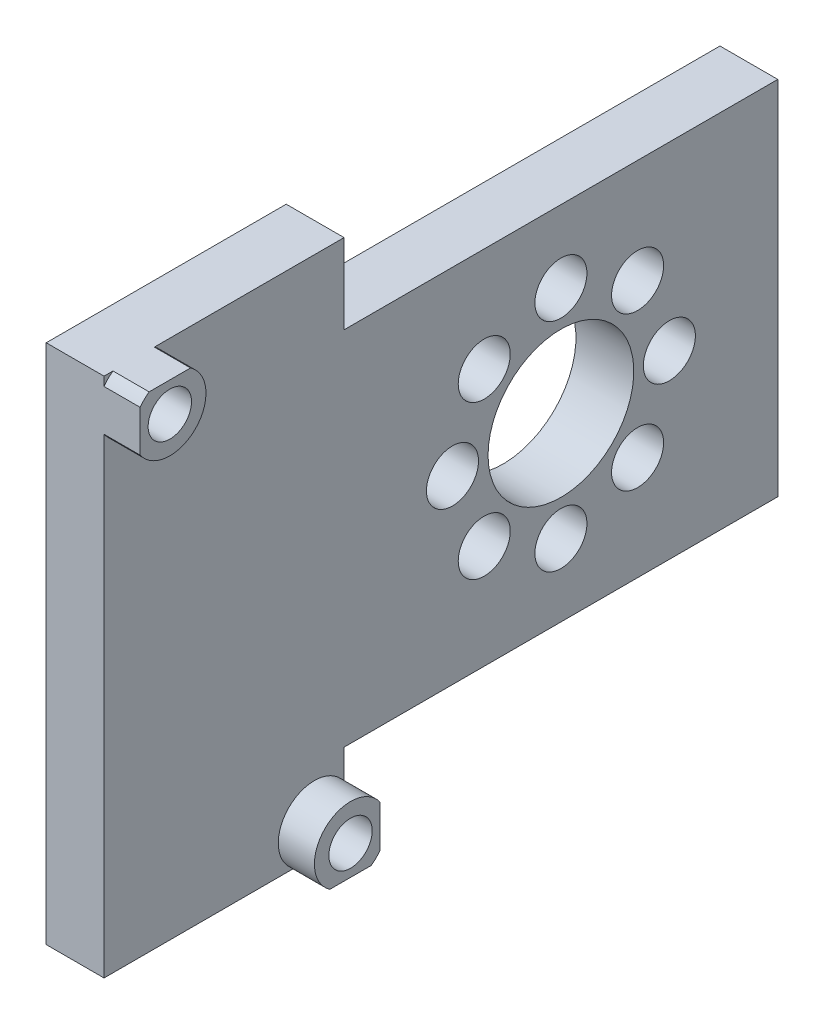
ISO-10303-21;
HEADER;
FILE_DESCRIPTION(('STEP AP214'),'2;1');
FILE_NAME('part.step','',(''),(''),'','','');
FILE_SCHEMA(('AUTOMOTIVE_DESIGN { 1 0 10303 214 1 1 1 1 }'));
ENDSEC;
DATA;
#1=APPLICATION_CONTEXT('core data for automotive mechanical design processes');
#2=APPLICATION_PROTOCOL_DEFINITION('international standard','automotive_design',2000,#1);
#3=PRODUCT_CONTEXT('',#1,'mechanical');
#4=PRODUCT('Part','Part','',(#3));
#5=PRODUCT_RELATED_PRODUCT_CATEGORY('part','',(#4));
#6=PRODUCT_DEFINITION_FORMATION('','',#4);
#7=PRODUCT_DEFINITION_CONTEXT('part definition',#1,'design');
#8=PRODUCT_DEFINITION('design','',#6,#7);
#9=PRODUCT_DEFINITION_SHAPE('','',#8);
#10=(LENGTH_UNIT() NAMED_UNIT(*) SI_UNIT(.MILLI.,.METRE.));
#11=(NAMED_UNIT(*) PLANE_ANGLE_UNIT() SI_UNIT($,.RADIAN.));
#12=(NAMED_UNIT(*) SI_UNIT($,.STERADIAN.) SOLID_ANGLE_UNIT());
#13=UNCERTAINTY_MEASURE_WITH_UNIT(LENGTH_MEASURE(1.E-05),#10,'distance_accuracy_value','');
#14=(GEOMETRIC_REPRESENTATION_CONTEXT(3) GLOBAL_UNCERTAINTY_ASSIGNED_CONTEXT((#13)) GLOBAL_UNIT_ASSIGNED_CONTEXT((#10,
#11,#12)) REPRESENTATION_CONTEXT('',''));
#15=CARTESIAN_POINT('',(0.,0.,0.));
#16=DIRECTION('',(0.,0.,1.));
#17=DIRECTION('',(1.,0.,0.));
#18=AXIS2_PLACEMENT_3D('',#15,#16,#17);
#19=CARTESIAN_POINT('',(5.08,-22.89175,-10.541));
#20=DIRECTION('',(0.,0.,1.));
#21=DIRECTION('',(1.,0.,0.));
#22=AXIS2_PLACEMENT_3D('',#19,#20,#21);
#23=PLANE('',#22);
#24=DIRECTION('',(0.,1.,0.));
#25=VECTOR('',#24,1.);
#26=CARTESIAN_POINT('',(0.,-22.89175,-10.541));
#27=LINE('',#26,#25);
#28=CARTESIAN_POINT('',(0.,-22.89175,-10.541));
#29=VERTEX_POINT('',#28);
#30=CARTESIAN_POINT('',(0.,-15.875,-10.541));
#31=VERTEX_POINT('',#30);
#32=EDGE_CURVE('E277',#29,#31,#27,.T.);
#33=ORIENTED_EDGE('',*,*,#32,.T.);
#34=DIRECTION('',(-1.,0.,0.));
#35=VECTOR('',#34,1.);
#36=CARTESIAN_POINT('',(5.08,-15.875,-10.541));
#37=LINE('',#36,#35);
#38=CARTESIAN_POINT('',(5.08,-15.875,-10.541));
#39=VERTEX_POINT('',#38);
#40=EDGE_CURVE('E62',#39,#31,#37,.T.);
#41=ORIENTED_EDGE('',*,*,#40,.F.);
#42=DIRECTION('',(0.,1.,0.));
#43=VECTOR('',#42,1.);
#44=CARTESIAN_POINT('',(5.08,-22.89175,-10.541));
#45=LINE('',#44,#43);
#46=CARTESIAN_POINT('',(5.08,-18.4709958213007,-10.541));
#47=VERTEX_POINT('',#46);
#48=EDGE_CURVE('E269',#47,#39,#45,.T.);
#49=ORIENTED_EDGE('',*,*,#48,.F.);
#50=DIRECTION('',(-1.,0.,0.));
#51=VECTOR('',#50,1.);
#52=CARTESIAN_POINT('',(8.255,-18.4709958213007,-10.541));
#53=LINE('',#52,#51);
#54=CARTESIAN_POINT('',(8.255,-18.4709958213007,-10.541));
#55=VERTEX_POINT('',#54);
#56=EDGE_CURVE('E216',#55,#47,#53,.T.);
#57=ORIENTED_EDGE('',*,*,#56,.F.);
#58=DIRECTION('',(0.,1.,0.));
#59=VECTOR('',#58,1.);
#60=CARTESIAN_POINT('',(8.255,-22.1055041786993,-10.541));
#61=LINE('',#60,#59);
#62=CARTESIAN_POINT('',(8.255,-22.1055041786993,-10.541));
#63=VERTEX_POINT('',#62);
#64=EDGE_CURVE('E199',#63,#55,#61,.T.);
#65=ORIENTED_EDGE('',*,*,#64,.F.);
#66=DIRECTION('',(-1.,0.,0.));
#67=VECTOR('',#66,1.);
#68=CARTESIAN_POINT('',(8.255,-22.1055041786993,-10.541));
#69=LINE('',#68,#67);
#70=CARTESIAN_POINT('',(5.08,-22.1055041786993,-10.541));
#71=VERTEX_POINT('',#70);
#72=EDGE_CURVE('E219',#63,#71,#69,.T.);
#73=ORIENTED_EDGE('',*,*,#72,.T.);
#74=CARTESIAN_POINT('',(5.08,-22.89175,-10.541));
#75=VERTEX_POINT('',#74);
#76=EDGE_CURVE('E266',#75,#71,#45,.T.);
#77=ORIENTED_EDGE('',*,*,#76,.F.);
#78=DIRECTION('',(-1.,0.,0.));
#79=VECTOR('',#78,1.);
#80=CARTESIAN_POINT('',(5.08,-22.89175,-10.541));
#81=LINE('',#80,#79);
#82=EDGE_CURVE('E281',#75,#29,#81,.T.);
#83=ORIENTED_EDGE('',*,*,#82,.T.);
#84=EDGE_LOOP('',(#33,#41,#49,#57,#65,#73,#77,#83));
#85=FACE_BOUND('',#84,.T.);
#86=ADVANCED_FACE('F39',(#85),#23,.F.);
#87=CARTESIAN_POINT('',(5.08,0.,0.));
#88=DIRECTION('',(1.,0.,0.));
#89=DIRECTION('',(0.,0.,-1.));
#90=AXIS2_PLACEMENT_3D('',#87,#88,#89);
#91=PLANE('',#90);
#92=CARTESIAN_POINT('',(5.08,-20.28825,-7.9375));
#93=DIRECTION('',(1.,0.,0.));
#94=DIRECTION('',(0.,0.,-1.));
#95=AXIS2_PLACEMENT_3D('',#92,#93,#94);
#96=CIRCLE('',#95,3.175);
#97=CARTESIAN_POINT('',(5.08,-22.89175,-9.7547541786993));
#98=VERTEX_POINT('',#97);
#99=EDGE_CURVE('E194',#98,#71,#96,.T.);
#100=ORIENTED_EDGE('',*,*,#99,.F.);
#101=DIRECTION('',(0.,0.,-1.));
#102=VECTOR('',#101,1.);
#103=CARTESIAN_POINT('',(5.08,-22.89175,10.541));
#104=LINE('',#103,#102);
#105=EDGE_CURVE('E263',#98,#75,#104,.T.);
#106=ORIENTED_EDGE('',*,*,#105,.T.);
#107=ORIENTED_EDGE('',*,*,#76,.T.);
#108=EDGE_LOOP('',(#100,#106,#107));
#109=FACE_BOUND('',#108,.T.);
#110=ADVANCED_FACE('F399',(#109),#91,.T.);
#111=CARTESIAN_POINT('',(5.08,20.28825,7.9375));
#112=DIRECTION('',(1.,0.,0.));
#113=DIRECTION('',(0.,0.,-1.));
#114=AXIS2_PLACEMENT_3D('',#111,#112,#113);
#115=CIRCLE('',#114,3.175);
#116=CARTESIAN_POINT('',(5.08,22.89175,9.75475417869928));
#117=VERTEX_POINT('',#116);
#118=CARTESIAN_POINT('',(5.08,22.1055041786993,10.541));
#119=VERTEX_POINT('',#118);
#120=EDGE_CURVE('E238',#117,#119,#115,.T.);
#121=ORIENTED_EDGE('',*,*,#120,.F.);
#122=DIRECTION('',(0.,0.,1.));
#123=VECTOR('',#122,1.);
#124=CARTESIAN_POINT('',(5.08,22.89175,10.541));
#125=LINE('',#124,#123);
#126=CARTESIAN_POINT('',(5.08,22.89175,10.541));
#127=VERTEX_POINT('',#126);
#128=EDGE_CURVE('E260',#117,#127,#125,.T.);
#129=ORIENTED_EDGE('',*,*,#128,.T.);
#130=DIRECTION('',(0.,-1.,0.));
#131=VECTOR('',#130,1.);
#132=CARTESIAN_POINT('',(5.08,-22.89175,10.541));
#133=LINE('',#132,#131);
#134=EDGE_CURVE('E261',#127,#119,#133,.T.);
#135=ORIENTED_EDGE('',*,*,#134,.T.);
#136=EDGE_LOOP('',(#121,#129,#135));
#137=FACE_BOUND('',#136,.T.);
#138=ADVANCED_FACE('F407',(#137),#91,.T.);
#139=CARTESIAN_POINT('',(5.08,-20.28825,-7.9375));
#140=DIRECTION('',(1.,0.,0.));
#141=DIRECTION('',(0.,0.,-1.));
#142=AXIS2_PLACEMENT_3D('',#139,#140,#141);
#143=CIRCLE('',#142,3.175);
#144=CARTESIAN_POINT('',(5.08,-22.89175,-6.1202458213007));
#145=VERTEX_POINT('',#144);
#146=EDGE_CURVE('E200',#47,#145,#143,.T.);
#147=ORIENTED_EDGE('',*,*,#146,.F.);
#148=ORIENTED_EDGE('',*,*,#48,.T.);
#149=DIRECTION('',(0.,0.,1.));
#150=VECTOR('',#149,1.);
#151=CARTESIAN_POINT('',(5.08,-15.875,-10.541));
#152=LINE('',#151,#150);
#153=CARTESIAN_POINT('',(5.08,-15.875,-48.641));
#154=VERTEX_POINT('',#153);
#155=EDGE_CURVE('E171',#154,#39,#152,.T.);
#156=ORIENTED_EDGE('',*,*,#155,.F.);
#157=DIRECTION('',(0.,-1.,0.));
#158=VECTOR('',#157,1.);
#159=CARTESIAN_POINT('',(5.08,-15.875,-48.641));
#160=LINE('',#159,#158);
#161=CARTESIAN_POINT('',(5.08,15.875,-48.641));
#162=VERTEX_POINT('',#161);
#163=EDGE_CURVE('E158',#162,#154,#160,.T.);
#164=ORIENTED_EDGE('',*,*,#163,.F.);
#165=DIRECTION('',(0.,0.,-1.));
#166=VECTOR('',#165,1.);
#167=CARTESIAN_POINT('',(5.08,15.875,-10.541));
#168=LINE('',#167,#166);
#169=CARTESIAN_POINT('',(5.08,15.875,-10.541));
#170=VERTEX_POINT('',#169);
#171=EDGE_CURVE('E168',#170,#162,#168,.T.);
#172=ORIENTED_EDGE('',*,*,#171,.F.);
#173=CARTESIAN_POINT('',(5.08,22.89175,-10.541));
#174=VERTEX_POINT('',#173);
#175=EDGE_CURVE('E54',#170,#174,#45,.T.);
#176=ORIENTED_EDGE('',*,*,#175,.T.);
#177=CARTESIAN_POINT('',(5.08,22.89175,6.12024582130073));
#178=VERTEX_POINT('',#177);
#179=EDGE_CURVE('E257',#174,#178,#125,.T.);
#180=ORIENTED_EDGE('',*,*,#179,.T.);
#181=CARTESIAN_POINT('',(5.08,20.28825,7.9375));
#182=DIRECTION('',(1.,0.,0.));
#183=DIRECTION('',(0.,0.,-1.));
#184=AXIS2_PLACEMENT_3D('',#181,#182,#183);
#185=CIRCLE('',#184,3.175);
#186=CARTESIAN_POINT('',(5.08,18.4709958213007,10.541));
#187=VERTEX_POINT('',#186);
#188=EDGE_CURVE('E235',#187,#178,#185,.T.);
#189=ORIENTED_EDGE('',*,*,#188,.F.);
#190=CARTESIAN_POINT('',(5.08,-22.89175,10.541));
#191=VERTEX_POINT('',#190);
#192=EDGE_CURVE('E259',#187,#191,#133,.T.);
#193=ORIENTED_EDGE('',*,*,#192,.T.);
#194=EDGE_CURVE('E264',#191,#145,#104,.T.);
#195=ORIENTED_EDGE('',*,*,#194,.T.);
#196=EDGE_LOOP('',(#147,#148,#156,#164,#172,#176,#180,#189,#193,#195));
#197=FACE_BOUND('',#196,.T.);
#198=CARTESIAN_POINT('',(5.08,6.73519209080187,-22.8558079091981));
#199=DIRECTION('',(-1.,0.,0.));
#200=DIRECTION('',(0.,0.,1.));
#201=AXIS2_PLACEMENT_3D('',#198,#199,#200);
#202=CIRCLE('',#201,2.286);
#203=CARTESIAN_POINT('',(5.08,6.73519209080187,-20.5698079091981));
#204=VERTEX_POINT('',#203);
#205=EDGE_CURVE('E347',#204,#204,#202,.T.);
#206=ORIENTED_EDGE('',*,*,#205,.T.);
#207=EDGE_LOOP('',(#206));
#208=FACE_BOUND('',#207,.T.);
#209=CARTESIAN_POINT('',(5.08,9.52500000000001,-29.591));
#210=DIRECTION('',(-1.,0.,0.));
#211=DIRECTION('',(0.,0.,1.));
#212=AXIS2_PLACEMENT_3D('',#209,#210,#211);
#213=CIRCLE('',#212,2.286);
#214=CARTESIAN_POINT('',(5.08,9.52500000000001,-27.305));
#215=VERTEX_POINT('',#214);
#216=EDGE_CURVE('E341',#215,#215,#213,.T.);
#217=ORIENTED_EDGE('',*,*,#216,.T.);
#218=EDGE_LOOP('',(#217));
#219=FACE_BOUND('',#218,.T.);
#220=CARTESIAN_POINT('',(5.08,6.73519209080187,-36.3261920908019));
#221=DIRECTION('',(-1.,0.,0.));
#222=DIRECTION('',(0.,0.,1.));
#223=AXIS2_PLACEMENT_3D('',#220,#221,#222);
#224=CIRCLE('',#223,2.286);
#225=CARTESIAN_POINT('',(5.08,6.73519209080187,-34.0401920908019));
#226=VERTEX_POINT('',#225);
#227=EDGE_CURVE('E335',#226,#226,#224,.T.);
#228=ORIENTED_EDGE('',*,*,#227,.T.);
#229=EDGE_LOOP('',(#228));
#230=FACE_BOUND('',#229,.T.);
#231=CARTESIAN_POINT('',(5.08,0.,-39.116));
#232=DIRECTION('',(-1.,0.,0.));
#233=DIRECTION('',(0.,0.,1.));
#234=AXIS2_PLACEMENT_3D('',#231,#232,#233);
#235=CIRCLE('',#234,2.286);
#236=CARTESIAN_POINT('',(5.08,0.,-36.83));
#237=VERTEX_POINT('',#236);
#238=EDGE_CURVE('E329',#237,#237,#235,.T.);
#239=ORIENTED_EDGE('',*,*,#238,.T.);
#240=EDGE_LOOP('',(#239));
#241=FACE_BOUND('',#240,.T.);
#242=CARTESIAN_POINT('',(5.08,-6.73519209080186,-36.3261920908019));
#243=DIRECTION('',(-1.,0.,0.));
#244=DIRECTION('',(0.,0.,1.));
#245=AXIS2_PLACEMENT_3D('',#242,#243,#244);
#246=CIRCLE('',#245,2.28600000000001);
#247=CARTESIAN_POINT('',(5.08,-6.73519209080186,-34.0401920908019));
#248=VERTEX_POINT('',#247);
#249=EDGE_CURVE('E323',#248,#248,#246,.T.);
#250=ORIENTED_EDGE('',*,*,#249,.T.);
#251=EDGE_LOOP('',(#250));
#252=FACE_BOUND('',#251,.T.);
#253=CARTESIAN_POINT('',(5.08,-9.525,-29.591));
#254=DIRECTION('',(-1.,0.,0.));
#255=DIRECTION('',(0.,0.,1.));
#256=AXIS2_PLACEMENT_3D('',#253,#254,#255);
#257=CIRCLE('',#256,2.286);
#258=CARTESIAN_POINT('',(5.08,-9.525,-27.305));
#259=VERTEX_POINT('',#258);
#260=EDGE_CURVE('E317',#259,#259,#257,.T.);
#261=ORIENTED_EDGE('',*,*,#260,.T.);
#262=EDGE_LOOP('',(#261));
#263=FACE_BOUND('',#262,.T.);
#264=CARTESIAN_POINT('',(5.08,-6.73519209080187,-22.8558079091981));
#265=DIRECTION('',(-1.,0.,0.));
#266=DIRECTION('',(0.,0.,1.));
#267=AXIS2_PLACEMENT_3D('',#264,#265,#266);
#268=CIRCLE('',#267,2.286);
#269=CARTESIAN_POINT('',(5.08,-6.73519209080187,-20.5698079091981));
#270=VERTEX_POINT('',#269);
#271=EDGE_CURVE('E311',#270,#270,#268,.T.);
#272=ORIENTED_EDGE('',*,*,#271,.T.);
#273=EDGE_LOOP('',(#272));
#274=FACE_BOUND('',#273,.T.);
#275=CARTESIAN_POINT('',(5.08,0.,-20.066));
#276=DIRECTION('',(-1.,0.,0.));
#277=DIRECTION('',(0.,0.,1.));
#278=AXIS2_PLACEMENT_3D('',#275,#276,#277);
#279=CIRCLE('',#278,2.286);
#280=CARTESIAN_POINT('',(5.08,0.,-17.78));
#281=VERTEX_POINT('',#280);
#282=EDGE_CURVE('E305',#281,#281,#279,.T.);
#283=ORIENTED_EDGE('',*,*,#282,.T.);
#284=EDGE_LOOP('',(#283));
#285=FACE_BOUND('',#284,.T.);
#286=CARTESIAN_POINT('',(5.08,0.,-29.591));
#287=DIRECTION('',(-1.,0.,0.));
#288=DIRECTION('',(0.,0.,1.));
#289=AXIS2_PLACEMENT_3D('',#286,#287,#288);
#290=CIRCLE('',#289,6.4008);
#291=CARTESIAN_POINT('',(5.08,0.,-23.1902000000001));
#292=VERTEX_POINT('',#291);
#293=EDGE_CURVE('E185',#292,#292,#290,.T.);
#294=ORIENTED_EDGE('',*,*,#293,.T.);
#295=EDGE_LOOP('',(#294));
#296=FACE_BOUND('',#295,.T.);
#297=ADVANCED_FACE('F174',(#197,#208,#219,#230,#241,#252,#263,#274,#285,#296),#91,.T.);
#298=CARTESIAN_POINT('',(0.,0.,0.));
#299=DIRECTION('',(1.,0.,0.));
#300=DIRECTION('',(0.,0.,-1.));
#301=AXIS2_PLACEMENT_3D('',#298,#299,#300);
#302=PLANE('',#301);
#303=DIRECTION('',(0.,0.,1.));
#304=VECTOR('',#303,1.);
#305=CARTESIAN_POINT('',(0.,22.89175,10.541));
#306=LINE('',#305,#304);
#307=CARTESIAN_POINT('',(0.,22.89175,-10.541));
#308=VERTEX_POINT('',#307);
#309=CARTESIAN_POINT('',(0.,22.89175,10.541));
#310=VERTEX_POINT('',#309);
#311=EDGE_CURVE('E256',#308,#310,#306,.T.);
#312=ORIENTED_EDGE('',*,*,#311,.F.);
#313=CARTESIAN_POINT('',(0.,15.875,-10.541));
#314=VERTEX_POINT('',#313);
#315=EDGE_CURVE('E276',#314,#308,#27,.T.);
#316=ORIENTED_EDGE('',*,*,#315,.F.);
#317=DIRECTION('',(0.,0.,-1.));
#318=VECTOR('',#317,1.);
#319=CARTESIAN_POINT('',(0.,15.875,-10.541));
#320=LINE('',#319,#318);
#321=CARTESIAN_POINT('',(0.,15.875,-48.641));
#322=VERTEX_POINT('',#321);
#323=EDGE_CURVE('E184',#314,#322,#320,.T.);
#324=ORIENTED_EDGE('',*,*,#323,.T.);
#325=DIRECTION('',(0.,-1.,0.));
#326=VECTOR('',#325,1.);
#327=CARTESIAN_POINT('',(0.,-15.875,-48.641));
#328=LINE('',#327,#326);
#329=CARTESIAN_POINT('',(0.,-15.875,-48.641));
#330=VERTEX_POINT('',#329);
#331=EDGE_CURVE('E160',#322,#330,#328,.T.);
#332=ORIENTED_EDGE('',*,*,#331,.T.);
#333=DIRECTION('',(0.,0.,1.));
#334=VECTOR('',#333,1.);
#335=CARTESIAN_POINT('',(0.,-15.875,-10.541));
#336=LINE('',#335,#334);
#337=EDGE_CURVE('E181',#330,#31,#336,.T.);
#338=ORIENTED_EDGE('',*,*,#337,.T.);
#339=ORIENTED_EDGE('',*,*,#32,.F.);
#340=DIRECTION('',(0.,0.,-1.));
#341=VECTOR('',#340,1.);
#342=CARTESIAN_POINT('',(0.,-22.89175,10.541));
#343=LINE('',#342,#341);
#344=CARTESIAN_POINT('',(0.,-22.89175,10.541));
#345=VERTEX_POINT('',#344);
#346=EDGE_CURVE('E274',#345,#29,#343,.T.);
#347=ORIENTED_EDGE('',*,*,#346,.F.);
#348=DIRECTION('',(0.,-1.,0.));
#349=VECTOR('',#348,1.);
#350=CARTESIAN_POINT('',(0.,-22.89175,10.541));
#351=LINE('',#350,#349);
#352=EDGE_CURVE('E272',#310,#345,#351,.T.);
#353=ORIENTED_EDGE('',*,*,#352,.F.);
#354=EDGE_LOOP('',(#312,#316,#324,#332,#338,#339,#347,#353));
#355=FACE_BOUND('',#354,.T.);
#356=CARTESIAN_POINT('',(0.,-20.28825,-7.9375));
#357=DIRECTION('',(1.,0.,0.));
#358=DIRECTION('',(0.,0.,-1.));
#359=AXIS2_PLACEMENT_3D('',#356,#357,#358);
#360=CIRCLE('',#359,1.905);
#361=CARTESIAN_POINT('',(0.,-20.28825,-9.8425));
#362=VERTEX_POINT('',#361);
#363=EDGE_CURVE('E253',#362,#362,#360,.T.);
#364=ORIENTED_EDGE('',*,*,#363,.T.);
#365=EDGE_LOOP('',(#364));
#366=FACE_BOUND('',#365,.T.);
#367=CARTESIAN_POINT('',(0.,20.28825,7.9375));
#368=DIRECTION('',(1.,0.,0.));
#369=DIRECTION('',(0.,0.,-1.));
#370=AXIS2_PLACEMENT_3D('',#367,#368,#369);
#371=CIRCLE('',#370,1.905);
#372=CARTESIAN_POINT('',(0.,20.28825,6.0325));
#373=VERTEX_POINT('',#372);
#374=EDGE_CURVE('E222',#373,#373,#371,.T.);
#375=ORIENTED_EDGE('',*,*,#374,.T.);
#376=EDGE_LOOP('',(#375));
#377=FACE_BOUND('',#376,.T.);
#378=CARTESIAN_POINT('',(0.,6.73519209080187,-22.8558079091981));
#379=DIRECTION('',(-1.,0.,0.));
#380=DIRECTION('',(0.,0.,1.));
#381=AXIS2_PLACEMENT_3D('',#378,#379,#380);
#382=CIRCLE('',#381,2.286);
#383=CARTESIAN_POINT('',(0.,6.73519209080187,-20.5698079091981));
#384=VERTEX_POINT('',#383);
#385=EDGE_CURVE('E350',#384,#384,#382,.T.);
#386=ORIENTED_EDGE('',*,*,#385,.F.);
#387=EDGE_LOOP('',(#386));
#388=FACE_BOUND('',#387,.T.);
#389=CARTESIAN_POINT('',(0.,9.52500000000001,-29.591));
#390=DIRECTION('',(-1.,0.,0.));
#391=DIRECTION('',(0.,0.,1.));
#392=AXIS2_PLACEMENT_3D('',#389,#390,#391);
#393=CIRCLE('',#392,2.286);
#394=CARTESIAN_POINT('',(0.,9.52500000000001,-27.305));
#395=VERTEX_POINT('',#394);
#396=EDGE_CURVE('E344',#395,#395,#393,.T.);
#397=ORIENTED_EDGE('',*,*,#396,.F.);
#398=EDGE_LOOP('',(#397));
#399=FACE_BOUND('',#398,.T.);
#400=CARTESIAN_POINT('',(0.,6.73519209080187,-36.3261920908019));
#401=DIRECTION('',(-1.,0.,0.));
#402=DIRECTION('',(0.,0.,1.));
#403=AXIS2_PLACEMENT_3D('',#400,#401,#402);
#404=CIRCLE('',#403,2.286);
#405=CARTESIAN_POINT('',(0.,6.73519209080187,-34.0401920908019));
#406=VERTEX_POINT('',#405);
#407=EDGE_CURVE('E338',#406,#406,#404,.T.);
#408=ORIENTED_EDGE('',*,*,#407,.F.);
#409=EDGE_LOOP('',(#408));
#410=FACE_BOUND('',#409,.T.);
#411=CARTESIAN_POINT('',(0.,0.,-39.116));
#412=DIRECTION('',(-1.,0.,0.));
#413=DIRECTION('',(0.,0.,1.));
#414=AXIS2_PLACEMENT_3D('',#411,#412,#413);
#415=CIRCLE('',#414,2.286);
#416=CARTESIAN_POINT('',(0.,0.,-36.83));
#417=VERTEX_POINT('',#416);
#418=EDGE_CURVE('E332',#417,#417,#415,.T.);
#419=ORIENTED_EDGE('',*,*,#418,.F.);
#420=EDGE_LOOP('',(#419));
#421=FACE_BOUND('',#420,.T.);
#422=CARTESIAN_POINT('',(0.,-6.73519209080186,-36.3261920908019));
#423=DIRECTION('',(-1.,0.,0.));
#424=DIRECTION('',(0.,0.,1.));
#425=AXIS2_PLACEMENT_3D('',#422,#423,#424);
#426=CIRCLE('',#425,2.28600000000001);
#427=CARTESIAN_POINT('',(0.,-6.73519209080186,-34.0401920908019));
#428=VERTEX_POINT('',#427);
#429=EDGE_CURVE('E326',#428,#428,#426,.T.);
#430=ORIENTED_EDGE('',*,*,#429,.F.);
#431=EDGE_LOOP('',(#430));
#432=FACE_BOUND('',#431,.T.);
#433=CARTESIAN_POINT('',(0.,-9.525,-29.591));
#434=DIRECTION('',(-1.,0.,0.));
#435=DIRECTION('',(0.,0.,1.));
#436=AXIS2_PLACEMENT_3D('',#433,#434,#435);
#437=CIRCLE('',#436,2.286);
#438=CARTESIAN_POINT('',(0.,-9.525,-27.305));
#439=VERTEX_POINT('',#438);
#440=EDGE_CURVE('E320',#439,#439,#437,.T.);
#441=ORIENTED_EDGE('',*,*,#440,.F.);
#442=EDGE_LOOP('',(#441));
#443=FACE_BOUND('',#442,.T.);
#444=CARTESIAN_POINT('',(0.,-6.73519209080187,-22.8558079091981));
#445=DIRECTION('',(-1.,0.,0.));
#446=DIRECTION('',(0.,0.,1.));
#447=AXIS2_PLACEMENT_3D('',#444,#445,#446);
#448=CIRCLE('',#447,2.286);
#449=CARTESIAN_POINT('',(0.,-6.73519209080187,-20.5698079091981));
#450=VERTEX_POINT('',#449);
#451=EDGE_CURVE('E314',#450,#450,#448,.T.);
#452=ORIENTED_EDGE('',*,*,#451,.F.);
#453=EDGE_LOOP('',(#452));
#454=FACE_BOUND('',#453,.T.);
#455=CARTESIAN_POINT('',(0.,0.,-20.066));
#456=DIRECTION('',(-1.,0.,0.));
#457=DIRECTION('',(0.,0.,1.));
#458=AXIS2_PLACEMENT_3D('',#455,#456,#457);
#459=CIRCLE('',#458,2.286);
#460=CARTESIAN_POINT('',(0.,0.,-17.78));
#461=VERTEX_POINT('',#460);
#462=EDGE_CURVE('E308',#461,#461,#459,.T.);
#463=ORIENTED_EDGE('',*,*,#462,.F.);
#464=EDGE_LOOP('',(#463));
#465=FACE_BOUND('',#464,.T.);
#466=CARTESIAN_POINT('',(0.,0.,-29.591));
#467=DIRECTION('',(-1.,0.,0.));
#468=DIRECTION('',(0.,0.,1.));
#469=AXIS2_PLACEMENT_3D('',#466,#467,#468);
#470=CIRCLE('',#469,6.4008);
#471=CARTESIAN_POINT('',(0.,0.,-23.1902000000001));
#472=VERTEX_POINT('',#471);
#473=EDGE_CURVE('E302',#472,#472,#470,.T.);
#474=ORIENTED_EDGE('',*,*,#473,.F.);
#475=EDGE_LOOP('',(#474));
#476=FACE_BOUND('',#475,.T.);
#477=ADVANCED_FACE('F295',(#355,#366,#377,#388,#399,#410,#421,#432,#443,#454,#465,#476),#302,.F.);
#478=CARTESIAN_POINT('',(5.08,22.89175,10.541));
#479=DIRECTION('',(0.,-1.,0.));
#480=DIRECTION('',(0.,0.,-1.));
#481=AXIS2_PLACEMENT_3D('',#478,#479,#480);
#482=PLANE('',#481);
#483=ORIENTED_EDGE('',*,*,#311,.T.);
#484=DIRECTION('',(-1.,0.,0.));
#485=VECTOR('',#484,1.);
#486=CARTESIAN_POINT('',(5.08,22.89175,10.541));
#487=LINE('',#486,#485);
#488=EDGE_CURVE('E11',#127,#310,#487,.T.);
#489=ORIENTED_EDGE('',*,*,#488,.F.);
#490=ORIENTED_EDGE('',*,*,#128,.F.);
#491=DIRECTION('',(-1.,0.,0.));
#492=VECTOR('',#491,1.);
#493=CARTESIAN_POINT('',(8.255,22.89175,9.75475417869928));
#494=LINE('',#493,#492);
#495=CARTESIAN_POINT('',(8.255,22.89175,9.75475417869928));
#496=VERTEX_POINT('',#495);
#497=EDGE_CURVE('E231',#496,#117,#494,.T.);
#498=ORIENTED_EDGE('',*,*,#497,.F.);
#499=DIRECTION('',(0.,0.,1.));
#500=VECTOR('',#499,1.);
#501=CARTESIAN_POINT('',(8.255,22.89175,9.75475417869928));
#502=LINE('',#501,#500);
#503=CARTESIAN_POINT('',(8.255,22.89175,6.12024582130073));
#504=VERTEX_POINT('',#503);
#505=EDGE_CURVE('E234',#504,#496,#502,.T.);
#506=ORIENTED_EDGE('',*,*,#505,.F.);
#507=DIRECTION('',(-1.,0.,0.));
#508=VECTOR('',#507,1.);
#509=CARTESIAN_POINT('',(8.255,22.89175,6.12024582130073));
#510=LINE('',#509,#508);
#511=EDGE_CURVE('E228',#504,#178,#510,.T.);
#512=ORIENTED_EDGE('',*,*,#511,.T.);
#513=ORIENTED_EDGE('',*,*,#179,.F.);
#514=DIRECTION('',(-1.,0.,0.));
#515=VECTOR('',#514,1.);
#516=CARTESIAN_POINT('',(5.08,22.89175,-10.541));
#517=LINE('',#516,#515);
#518=EDGE_CURVE('E268',#174,#308,#517,.T.);
#519=ORIENTED_EDGE('',*,*,#518,.T.);
#520=EDGE_LOOP('',(#483,#489,#490,#498,#506,#512,#513,#519));
#521=FACE_BOUND('',#520,.T.);
#522=ADVANCED_FACE('F41',(#521),#482,.F.);
#523=CARTESIAN_POINT('',(5.08,-22.89175,10.541));
#524=DIRECTION('',(0.,0.,-1.));
#525=DIRECTION('',(-1.,0.,0.));
#526=AXIS2_PLACEMENT_3D('',#523,#524,#525);
#527=PLANE('',#526);
#528=ORIENTED_EDGE('',*,*,#352,.T.);
#529=DIRECTION('',(-1.,0.,0.));
#530=VECTOR('',#529,1.);
#531=CARTESIAN_POINT('',(5.08,-22.89175,10.541));
#532=LINE('',#531,#530);
#533=EDGE_CURVE('E47',#191,#345,#532,.T.);
#534=ORIENTED_EDGE('',*,*,#533,.F.);
#535=ORIENTED_EDGE('',*,*,#192,.F.);
#536=DIRECTION('',(-1.,0.,0.));
#537=VECTOR('',#536,1.);
#538=CARTESIAN_POINT('',(8.255,18.4709958213007,10.541));
#539=LINE('',#538,#537);
#540=CARTESIAN_POINT('',(8.255,18.4709958213007,10.541));
#541=VERTEX_POINT('',#540);
#542=EDGE_CURVE('E225',#541,#187,#539,.T.);
#543=ORIENTED_EDGE('',*,*,#542,.F.);
#544=DIRECTION('',(0.,-1.,0.));
#545=VECTOR('',#544,1.);
#546=CARTESIAN_POINT('',(8.255,18.4709958213007,10.541));
#547=LINE('',#546,#545);
#548=CARTESIAN_POINT('',(8.255,22.1055041786993,10.541));
#549=VERTEX_POINT('',#548);
#550=EDGE_CURVE('E245',#549,#541,#547,.T.);
#551=ORIENTED_EDGE('',*,*,#550,.F.);
#552=DIRECTION('',(-1.,0.,0.));
#553=VECTOR('',#552,1.);
#554=CARTESIAN_POINT('',(8.255,22.1055041786993,10.541));
#555=LINE('',#554,#553);
#556=EDGE_CURVE('E188',#549,#119,#555,.T.);
#557=ORIENTED_EDGE('',*,*,#556,.T.);
#558=ORIENTED_EDGE('',*,*,#134,.F.);
#559=ORIENTED_EDGE('',*,*,#488,.T.);
#560=EDGE_LOOP('',(#528,#534,#535,#543,#551,#557,#558,#559));
#561=FACE_BOUND('',#560,.T.);
#562=ADVANCED_FACE('F421',(#561),#527,.F.);
#563=CARTESIAN_POINT('',(5.08,-22.89175,10.541));
#564=DIRECTION('',(0.,1.,0.));
#565=DIRECTION('',(0.,0.,1.));
#566=AXIS2_PLACEMENT_3D('',#563,#564,#565);
#567=PLANE('',#566);
#568=ORIENTED_EDGE('',*,*,#346,.T.);
#569=ORIENTED_EDGE('',*,*,#82,.F.);
#570=ORIENTED_EDGE('',*,*,#105,.F.);
#571=DIRECTION('',(-1.,0.,0.));
#572=VECTOR('',#571,1.);
#573=CARTESIAN_POINT('',(8.255,-22.89175,-9.7547541786993));
#574=LINE('',#573,#572);
#575=CARTESIAN_POINT('',(8.255,-22.89175,-9.7547541786993));
#576=VERTEX_POINT('',#575);
#577=EDGE_CURVE('E206',#576,#98,#574,.T.);
#578=ORIENTED_EDGE('',*,*,#577,.F.);
#579=DIRECTION('',(0.,0.,-1.));
#580=VECTOR('',#579,1.);
#581=CARTESIAN_POINT('',(8.255,-22.89175,-6.1202458213007));
#582=LINE('',#581,#580);
#583=CARTESIAN_POINT('',(8.255,-22.89175,-6.1202458213007));
#584=VERTEX_POINT('',#583);
#585=EDGE_CURVE('E204',#584,#576,#582,.T.);
#586=ORIENTED_EDGE('',*,*,#585,.F.);
#587=DIRECTION('',(-1.,0.,0.));
#588=VECTOR('',#587,1.);
#589=CARTESIAN_POINT('',(8.255,-22.89175,-6.1202458213007));
#590=LINE('',#589,#588);
#591=EDGE_CURVE('E213',#584,#145,#590,.T.);
#592=ORIENTED_EDGE('',*,*,#591,.T.);
#593=ORIENTED_EDGE('',*,*,#194,.F.);
#594=ORIENTED_EDGE('',*,*,#533,.T.);
#595=EDGE_LOOP('',(#568,#569,#570,#578,#586,#592,#593,#594));
#596=FACE_BOUND('',#595,.T.);
#597=ADVANCED_FACE('F288',(#596),#567,.F.);
#598=ORIENTED_EDGE('',*,*,#175,.F.);
#599=DIRECTION('',(-1.,0.,0.));
#600=VECTOR('',#599,1.);
#601=CARTESIAN_POINT('',(5.08,15.875,-10.541));
#602=LINE('',#601,#600);
#603=EDGE_CURVE('E165',#170,#314,#602,.T.);
#604=ORIENTED_EDGE('',*,*,#603,.T.);
#605=ORIENTED_EDGE('',*,*,#315,.T.);
#606=ORIENTED_EDGE('',*,*,#518,.F.);
#607=EDGE_LOOP('',(#598,#604,#605,#606));
#608=FACE_BOUND('',#607,.T.);
#609=ADVANCED_FACE('F401',(#608),#23,.F.);
#610=CARTESIAN_POINT('',(5.08,-20.28825,-7.9375));
#611=DIRECTION('',(-1.,0.,0.));
#612=DIRECTION('',(0.,0.,1.));
#613=AXIS2_PLACEMENT_3D('',#610,#611,#612);
#614=CYLINDRICAL_SURFACE('',#613,1.905);
#615=ORIENTED_EDGE('',*,*,#363,.F.);
#616=EDGE_LOOP('',(#615));
#617=FACE_BOUND('',#616,.T.);
#618=CARTESIAN_POINT('',(8.255,-20.28825,-7.9375));
#619=DIRECTION('',(1.,0.,0.));
#620=DIRECTION('',(0.,0.,-1.));
#621=AXIS2_PLACEMENT_3D('',#618,#619,#620);
#622=CIRCLE('',#621,1.905);
#623=CARTESIAN_POINT('',(8.255,-20.28825,-9.8425));
#624=VERTEX_POINT('',#623);
#625=EDGE_CURVE('E191',#624,#624,#622,.T.);
#626=ORIENTED_EDGE('',*,*,#625,.T.);
#627=EDGE_LOOP('',(#626));
#628=FACE_BOUND('',#627,.T.);
#629=ADVANCED_FACE('F412',(#617,#628),#614,.F.);
#630=CARTESIAN_POINT('',(5.08,20.28825,7.9375));
#631=DIRECTION('',(-1.,0.,0.));
#632=DIRECTION('',(0.,0.,1.));
#633=AXIS2_PLACEMENT_3D('',#630,#631,#632);
#634=CYLINDRICAL_SURFACE('',#633,1.905);
#635=ORIENTED_EDGE('',*,*,#374,.F.);
#636=EDGE_LOOP('',(#635));
#637=FACE_BOUND('',#636,.T.);
#638=CARTESIAN_POINT('',(8.255,20.28825,7.9375));
#639=DIRECTION('',(1.,0.,0.));
#640=DIRECTION('',(0.,0.,-1.));
#641=AXIS2_PLACEMENT_3D('',#638,#639,#640);
#642=CIRCLE('',#641,1.905);
#643=CARTESIAN_POINT('',(8.255,20.28825,6.0325));
#644=VERTEX_POINT('',#643);
#645=EDGE_CURVE('E195',#644,#644,#642,.T.);
#646=ORIENTED_EDGE('',*,*,#645,.T.);
#647=EDGE_LOOP('',(#646));
#648=FACE_BOUND('',#647,.T.);
#649=ADVANCED_FACE('F417',(#637,#648),#634,.F.);
#650=CARTESIAN_POINT('',(8.255,20.28825,7.9375));
#651=DIRECTION('',(1.,0.,0.));
#652=DIRECTION('',(0.,0.,-1.));
#653=AXIS2_PLACEMENT_3D('',#650,#651,#652);
#654=PLANE('',#653);
#655=CARTESIAN_POINT('',(8.255,20.28825,7.9375));
#656=DIRECTION('',(1.,0.,0.));
#657=DIRECTION('',(0.,0.,-1.));
#658=AXIS2_PLACEMENT_3D('',#655,#656,#657);
#659=CIRCLE('',#658,3.175);
#660=EDGE_CURVE('E239',#496,#549,#659,.T.);
#661=ORIENTED_EDGE('',*,*,#660,.T.);
#662=ORIENTED_EDGE('',*,*,#550,.T.);
#663=CARTESIAN_POINT('',(8.255,20.28825,7.9375));
#664=DIRECTION('',(1.,0.,0.));
#665=DIRECTION('',(0.,0.,-1.));
#666=AXIS2_PLACEMENT_3D('',#663,#664,#665);
#667=CIRCLE('',#666,3.175);
#668=EDGE_CURVE('E243',#541,#504,#667,.T.);
#669=ORIENTED_EDGE('',*,*,#668,.T.);
#670=ORIENTED_EDGE('',*,*,#505,.T.);
#671=EDGE_LOOP('',(#661,#662,#669,#670));
#672=FACE_BOUND('',#671,.T.);
#673=ORIENTED_EDGE('',*,*,#645,.F.);
#674=EDGE_LOOP('',(#673));
#675=FACE_BOUND('',#674,.T.);
#676=ADVANCED_FACE('F465',(#672,#675),#654,.T.);
#677=CARTESIAN_POINT('',(8.255,20.28825,7.9375));
#678=DIRECTION('',(-1.,0.,0.));
#679=DIRECTION('',(0.,0.,1.));
#680=AXIS2_PLACEMENT_3D('',#677,#678,#679);
#681=CYLINDRICAL_SURFACE('',#680,3.175);
#682=ORIENTED_EDGE('',*,*,#120,.T.);
#683=ORIENTED_EDGE('',*,*,#556,.F.);
#684=ORIENTED_EDGE('',*,*,#660,.F.);
#685=ORIENTED_EDGE('',*,*,#497,.T.);
#686=EDGE_LOOP('',(#682,#683,#684,#685));
#687=FACE_BOUND('',#686,.T.);
#688=ADVANCED_FACE('F462',(#687),#681,.T.);
#689=CARTESIAN_POINT('',(8.255,20.28825,7.9375));
#690=DIRECTION('',(-1.,0.,0.));
#691=DIRECTION('',(0.,0.,1.));
#692=AXIS2_PLACEMENT_3D('',#689,#690,#691);
#693=CYLINDRICAL_SURFACE('',#692,3.175);
#694=ORIENTED_EDGE('',*,*,#188,.T.);
#695=ORIENTED_EDGE('',*,*,#511,.F.);
#696=ORIENTED_EDGE('',*,*,#668,.F.);
#697=ORIENTED_EDGE('',*,*,#542,.T.);
#698=EDGE_LOOP('',(#694,#695,#696,#697));
#699=FACE_BOUND('',#698,.T.);
#700=ADVANCED_FACE('F436',(#699),#693,.T.);
#701=CARTESIAN_POINT('',(8.255,-20.28825,-7.9375));
#702=DIRECTION('',(1.,0.,0.));
#703=DIRECTION('',(0.,0.,-1.));
#704=AXIS2_PLACEMENT_3D('',#701,#702,#703);
#705=PLANE('',#704);
#706=CARTESIAN_POINT('',(8.255,-20.28825,-7.9375));
#707=DIRECTION('',(1.,0.,0.));
#708=DIRECTION('',(0.,0.,-1.));
#709=AXIS2_PLACEMENT_3D('',#706,#707,#708);
#710=CIRCLE('',#709,3.175);
#711=EDGE_CURVE('E196',#576,#63,#710,.T.);
#712=ORIENTED_EDGE('',*,*,#711,.T.);
#713=ORIENTED_EDGE('',*,*,#64,.T.);
#714=CARTESIAN_POINT('',(8.255,-20.28825,-7.9375));
#715=DIRECTION('',(1.,0.,0.));
#716=DIRECTION('',(0.,0.,-1.));
#717=AXIS2_PLACEMENT_3D('',#714,#715,#716);
#718=CIRCLE('',#717,3.175);
#719=EDGE_CURVE('E202',#55,#584,#718,.T.);
#720=ORIENTED_EDGE('',*,*,#719,.T.);
#721=ORIENTED_EDGE('',*,*,#585,.T.);
#722=EDGE_LOOP('',(#712,#713,#720,#721));
#723=FACE_BOUND('',#722,.T.);
#724=ORIENTED_EDGE('',*,*,#625,.F.);
#725=EDGE_LOOP('',(#724));
#726=FACE_BOUND('',#725,.T.);
#727=ADVANCED_FACE('F449',(#723,#726),#705,.T.);
#728=CARTESIAN_POINT('',(8.255,-20.28825,-7.9375));
#729=DIRECTION('',(-1.,0.,0.));
#730=DIRECTION('',(0.,0.,1.));
#731=AXIS2_PLACEMENT_3D('',#728,#729,#730);
#732=CYLINDRICAL_SURFACE('',#731,3.175);
#733=ORIENTED_EDGE('',*,*,#99,.T.);
#734=ORIENTED_EDGE('',*,*,#72,.F.);
#735=ORIENTED_EDGE('',*,*,#711,.F.);
#736=ORIENTED_EDGE('',*,*,#577,.T.);
#737=EDGE_LOOP('',(#733,#734,#735,#736));
#738=FACE_BOUND('',#737,.T.);
#739=ADVANCED_FACE('F453',(#738),#732,.T.);
#740=CARTESIAN_POINT('',(8.255,-20.28825,-7.9375));
#741=DIRECTION('',(-1.,0.,0.));
#742=DIRECTION('',(0.,0.,1.));
#743=AXIS2_PLACEMENT_3D('',#740,#741,#742);
#744=CYLINDRICAL_SURFACE('',#743,3.175);
#745=ORIENTED_EDGE('',*,*,#146,.T.);
#746=ORIENTED_EDGE('',*,*,#591,.F.);
#747=ORIENTED_EDGE('',*,*,#719,.F.);
#748=ORIENTED_EDGE('',*,*,#56,.T.);
#749=EDGE_LOOP('',(#745,#746,#747,#748));
#750=FACE_BOUND('',#749,.T.);
#751=ADVANCED_FACE('F441',(#750),#744,.T.);
#752=CARTESIAN_POINT('',(5.08,-15.875,-10.541));
#753=DIRECTION('',(0.,-1.,0.));
#754=DIRECTION('',(0.,0.,-1.));
#755=AXIS2_PLACEMENT_3D('',#752,#753,#754);
#756=PLANE('',#755);
#757=ORIENTED_EDGE('',*,*,#337,.F.);
#758=DIRECTION('',(-1.,0.,0.));
#759=VECTOR('',#758,1.);
#760=CARTESIAN_POINT('',(5.08,-15.875,-48.641));
#761=LINE('',#760,#759);
#762=EDGE_CURVE('E164',#154,#330,#761,.T.);
#763=ORIENTED_EDGE('',*,*,#762,.F.);
#764=ORIENTED_EDGE('',*,*,#155,.T.);
#765=ORIENTED_EDGE('',*,*,#40,.T.);
#766=EDGE_LOOP('',(#757,#763,#764,#765));
#767=FACE_BOUND('',#766,.T.);
#768=ADVANCED_FACE('F300',(#767),#756,.T.);
#769=CARTESIAN_POINT('',(5.08,-15.875,-48.641));
#770=DIRECTION('',(0.,0.,-1.));
#771=DIRECTION('',(0.,1.,0.));
#772=AXIS2_PLACEMENT_3D('',#769,#770,#771);
#773=PLANE('',#772);
#774=ORIENTED_EDGE('',*,*,#331,.F.);
#775=DIRECTION('',(-1.,0.,0.));
#776=VECTOR('',#775,1.);
#777=CARTESIAN_POINT('',(5.08,15.875,-48.641));
#778=LINE('',#777,#776);
#779=EDGE_CURVE('E154',#162,#322,#778,.T.);
#780=ORIENTED_EDGE('',*,*,#779,.F.);
#781=ORIENTED_EDGE('',*,*,#163,.T.);
#782=ORIENTED_EDGE('',*,*,#762,.T.);
#783=EDGE_LOOP('',(#774,#780,#781,#782));
#784=FACE_BOUND('',#783,.T.);
#785=ADVANCED_FACE('F156',(#784),#773,.T.);
#786=CARTESIAN_POINT('',(5.08,15.875,-10.541));
#787=DIRECTION('',(0.,1.,0.));
#788=DIRECTION('',(0.,0.,1.));
#789=AXIS2_PLACEMENT_3D('',#786,#787,#788);
#790=PLANE('',#789);
#791=ORIENTED_EDGE('',*,*,#323,.F.);
#792=ORIENTED_EDGE('',*,*,#603,.F.);
#793=ORIENTED_EDGE('',*,*,#171,.T.);
#794=ORIENTED_EDGE('',*,*,#779,.T.);
#795=EDGE_LOOP('',(#791,#792,#793,#794));
#796=FACE_BOUND('',#795,.T.);
#797=ADVANCED_FACE('F169',(#796),#790,.T.);
#798=CARTESIAN_POINT('',(5.08,0.,-29.591));
#799=DIRECTION('',(-1.,0.,0.));
#800=DIRECTION('',(0.,0.,1.));
#801=AXIS2_PLACEMENT_3D('',#798,#799,#800);
#802=CYLINDRICAL_SURFACE('',#801,6.4008);
#803=ORIENTED_EDGE('',*,*,#293,.F.);
#804=EDGE_LOOP('',(#803));
#805=FACE_BOUND('',#804,.T.);
#806=ORIENTED_EDGE('',*,*,#473,.T.);
#807=EDGE_LOOP('',(#806));
#808=FACE_BOUND('',#807,.T.);
#809=ADVANCED_FACE('F383',(#805,#808),#802,.F.);
#810=CARTESIAN_POINT('',(5.08,0.,-20.066));
#811=DIRECTION('',(-1.,0.,0.));
#812=DIRECTION('',(0.,0.,1.));
#813=AXIS2_PLACEMENT_3D('',#810,#811,#812);
#814=CYLINDRICAL_SURFACE('',#813,2.286);
#815=ORIENTED_EDGE('',*,*,#282,.F.);
#816=EDGE_LOOP('',(#815));
#817=FACE_BOUND('',#816,.T.);
#818=ORIENTED_EDGE('',*,*,#462,.T.);
#819=EDGE_LOOP('',(#818));
#820=FACE_BOUND('',#819,.T.);
#821=ADVANCED_FACE('F385',(#817,#820),#814,.F.);
#822=CARTESIAN_POINT('',(5.08,-6.73519209080187,-22.8558079091981));
#823=DIRECTION('',(-1.,0.,0.));
#824=DIRECTION('',(0.,0.,1.));
#825=AXIS2_PLACEMENT_3D('',#822,#823,#824);
#826=CYLINDRICAL_SURFACE('',#825,2.286);
#827=ORIENTED_EDGE('',*,*,#271,.F.);
#828=EDGE_LOOP('',(#827));
#829=FACE_BOUND('',#828,.T.);
#830=ORIENTED_EDGE('',*,*,#451,.T.);
#831=EDGE_LOOP('',(#830));
#832=FACE_BOUND('',#831,.T.);
#833=ADVANCED_FACE('F392',(#829,#832),#826,.F.);
#834=CARTESIAN_POINT('',(5.08,-9.525,-29.591));
#835=DIRECTION('',(-1.,0.,0.));
#836=DIRECTION('',(0.,0.,1.));
#837=AXIS2_PLACEMENT_3D('',#834,#835,#836);
#838=CYLINDRICAL_SURFACE('',#837,2.286);
#839=ORIENTED_EDGE('',*,*,#260,.F.);
#840=EDGE_LOOP('',(#839));
#841=FACE_BOUND('',#840,.T.);
#842=ORIENTED_EDGE('',*,*,#440,.T.);
#843=EDGE_LOOP('',(#842));
#844=FACE_BOUND('',#843,.T.);
#845=ADVANCED_FACE('F626',(#841,#844),#838,.F.);
#846=CARTESIAN_POINT('',(5.08,-6.73519209080186,-36.3261920908019));
#847=DIRECTION('',(-1.,0.,0.));
#848=DIRECTION('',(0.,0.,1.));
#849=AXIS2_PLACEMENT_3D('',#846,#847,#848);
#850=CYLINDRICAL_SURFACE('',#849,2.28600000000001);
#851=ORIENTED_EDGE('',*,*,#249,.F.);
#852=EDGE_LOOP('',(#851));
#853=FACE_BOUND('',#852,.T.);
#854=ORIENTED_EDGE('',*,*,#429,.T.);
#855=EDGE_LOOP('',(#854));
#856=FACE_BOUND('',#855,.T.);
#857=ADVANCED_FACE('F636',(#853,#856),#850,.F.);
#858=CARTESIAN_POINT('',(5.08,0.,-39.116));
#859=DIRECTION('',(-1.,0.,0.));
#860=DIRECTION('',(0.,0.,1.));
#861=AXIS2_PLACEMENT_3D('',#858,#859,#860);
#862=CYLINDRICAL_SURFACE('',#861,2.286);
#863=ORIENTED_EDGE('',*,*,#238,.F.);
#864=EDGE_LOOP('',(#863));
#865=FACE_BOUND('',#864,.T.);
#866=ORIENTED_EDGE('',*,*,#418,.T.);
#867=EDGE_LOOP('',(#866));
#868=FACE_BOUND('',#867,.T.);
#869=ADVANCED_FACE('F646',(#865,#868),#862,.F.);
#870=CARTESIAN_POINT('',(5.08,6.73519209080187,-36.3261920908019));
#871=DIRECTION('',(-1.,0.,0.));
#872=DIRECTION('',(0.,0.,1.));
#873=AXIS2_PLACEMENT_3D('',#870,#871,#872);
#874=CYLINDRICAL_SURFACE('',#873,2.286);
#875=ORIENTED_EDGE('',*,*,#227,.F.);
#876=EDGE_LOOP('',(#875));
#877=FACE_BOUND('',#876,.T.);
#878=ORIENTED_EDGE('',*,*,#407,.T.);
#879=EDGE_LOOP('',(#878));
#880=FACE_BOUND('',#879,.T.);
#881=ADVANCED_FACE('F656',(#877,#880),#874,.F.);
#882=CARTESIAN_POINT('',(5.08,9.52500000000001,-29.591));
#883=DIRECTION('',(-1.,0.,0.));
#884=DIRECTION('',(0.,0.,1.));
#885=AXIS2_PLACEMENT_3D('',#882,#883,#884);
#886=CYLINDRICAL_SURFACE('',#885,2.286);
#887=ORIENTED_EDGE('',*,*,#216,.F.);
#888=EDGE_LOOP('',(#887));
#889=FACE_BOUND('',#888,.T.);
#890=ORIENTED_EDGE('',*,*,#396,.T.);
#891=EDGE_LOOP('',(#890));
#892=FACE_BOUND('',#891,.T.);
#893=ADVANCED_FACE('F360',(#889,#892),#886,.F.);
#894=CARTESIAN_POINT('',(5.08,6.73519209080187,-22.8558079091981));
#895=DIRECTION('',(-1.,0.,0.));
#896=DIRECTION('',(0.,0.,1.));
#897=AXIS2_PLACEMENT_3D('',#894,#895,#896);
#898=CYLINDRICAL_SURFACE('',#897,2.286);
#899=ORIENTED_EDGE('',*,*,#205,.F.);
#900=EDGE_LOOP('',(#899));
#901=FACE_BOUND('',#900,.T.);
#902=ORIENTED_EDGE('',*,*,#385,.T.);
#903=EDGE_LOOP('',(#902));
#904=FACE_BOUND('',#903,.T.);
#905=ADVANCED_FACE('F357',(#901,#904),#898,.F.);
#906=CLOSED_SHELL('',(#86,#110,#138,#297,#477,#522,#562,#597,#609,#629,#649,#676,#688,#700,#727,
#739,#751,#768,#785,#797,#809,#821,#833,#845,#857,#869,#881,#893,#905));
#907=MANIFOLD_SOLID_BREP('B2',#906);
#908=ADVANCED_BREP_SHAPE_REPRESENTATION('',(#18,#907),#14);
#909=SHAPE_DEFINITION_REPRESENTATION(#9,#908);
ENDSEC;
END-ISO-10303-21;
